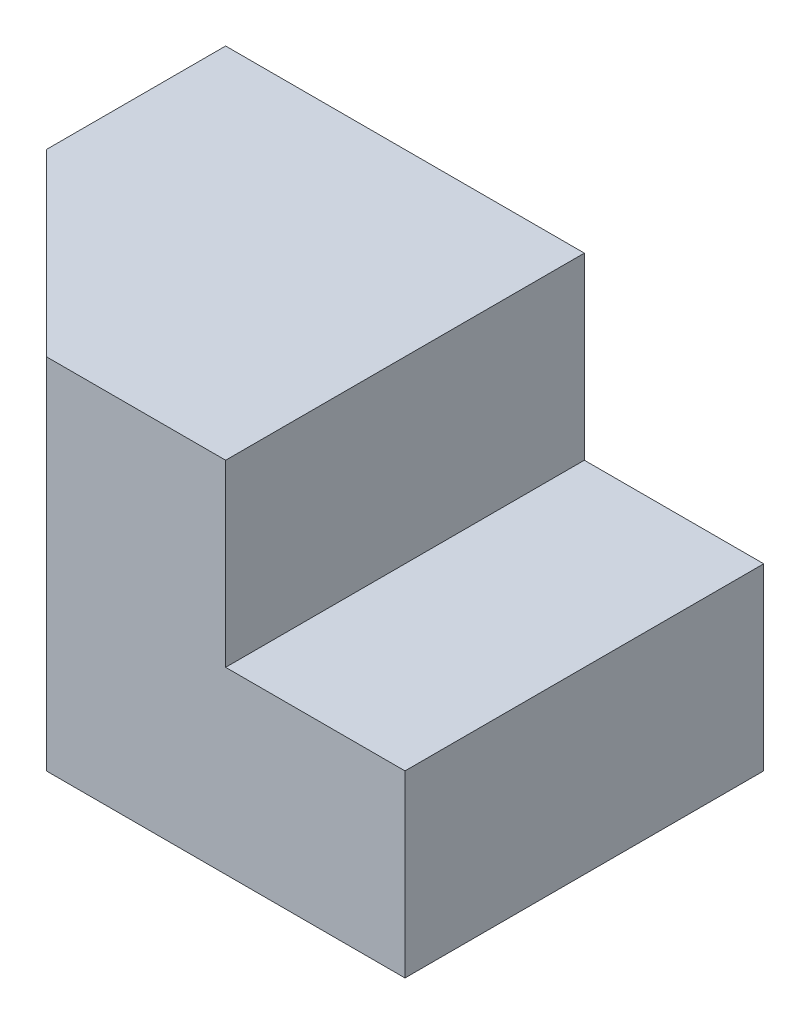
ISO-10303-21;
HEADER;
FILE_DESCRIPTION(('STEP AP214'),'2;1');
FILE_NAME('part.step','',(''),(''),'','','');
FILE_SCHEMA(('AUTOMOTIVE_DESIGN { 1 0 10303 214 1 1 1 1 }'));
ENDSEC;
DATA;
#1=APPLICATION_CONTEXT('core data for automotive mechanical design processes');
#2=APPLICATION_PROTOCOL_DEFINITION('international standard','automotive_design',2000,#1);
#3=PRODUCT_CONTEXT('',#1,'mechanical');
#4=PRODUCT('Part','Part','',(#3));
#5=PRODUCT_RELATED_PRODUCT_CATEGORY('part','',(#4));
#6=PRODUCT_DEFINITION_FORMATION('','',#4);
#7=PRODUCT_DEFINITION_CONTEXT('part definition',#1,'design');
#8=PRODUCT_DEFINITION('design','',#6,#7);
#9=PRODUCT_DEFINITION_SHAPE('','',#8);
#10=(LENGTH_UNIT() NAMED_UNIT(*) SI_UNIT(.MILLI.,.METRE.));
#11=(NAMED_UNIT(*) PLANE_ANGLE_UNIT() SI_UNIT($,.RADIAN.));
#12=(NAMED_UNIT(*) SI_UNIT($,.STERADIAN.) SOLID_ANGLE_UNIT());
#13=UNCERTAINTY_MEASURE_WITH_UNIT(LENGTH_MEASURE(1.E-05),#10,'distance_accuracy_value','');
#14=(GEOMETRIC_REPRESENTATION_CONTEXT(3) GLOBAL_UNCERTAINTY_ASSIGNED_CONTEXT((#13)) GLOBAL_UNIT_ASSIGNED_CONTEXT((#10,
#11,#12)) REPRESENTATION_CONTEXT('',''));
#15=CARTESIAN_POINT('',(0.,0.,0.));
#16=DIRECTION('',(0.,0.,1.));
#17=DIRECTION('',(1.,0.,0.));
#18=AXIS2_PLACEMENT_3D('',#15,#16,#17);
#19=CARTESIAN_POINT('',(-19.0958408679928,0.,40.));
#20=DIRECTION('',(1.,0.,0.));
#21=DIRECTION('',(0.,0.,-1.));
#22=AXIS2_PLACEMENT_3D('',#19,#20,#21);
#23=PLANE('',#22);
#24=DIRECTION('',(0.,-1.,0.));
#25=VECTOR('',#24,1.);
#26=CARTESIAN_POINT('',(-19.0958408679928,0.,0.));
#27=LINE('',#26,#25);
#28=CARTESIAN_POINT('',(-19.0958408679928,19.1320072332731,0.));
#29=VERTEX_POINT('',#28);
#30=CARTESIAN_POINT('',(-19.0958408679928,-0.867992766726944,0.));
#31=VERTEX_POINT('',#30);
#32=EDGE_CURVE('E116',#29,#31,#27,.T.);
#33=ORIENTED_EDGE('',*,*,#32,.F.);
#34=DIRECTION('',(0.,0.,-1.));
#35=VECTOR('',#34,1.);
#36=CARTESIAN_POINT('',(-19.0958408679928,19.1320072332731,40.));
#37=LINE('',#36,#35);
#38=CARTESIAN_POINT('',(-19.0958408679928,19.1320072332731,40.));
#39=VERTEX_POINT('',#38);
#40=EDGE_CURVE('E11',#39,#29,#37,.T.);
#41=ORIENTED_EDGE('',*,*,#40,.F.);
#42=DIRECTION('',(0.,-1.,0.));
#43=VECTOR('',#42,1.);
#44=CARTESIAN_POINT('',(-19.0958408679928,0.,40.));
#45=LINE('',#44,#43);
#46=CARTESIAN_POINT('',(-19.0958408679928,-0.867992766726944,40.));
#47=VERTEX_POINT('',#46);
#48=EDGE_CURVE('E148',#39,#47,#45,.T.);
#49=ORIENTED_EDGE('',*,*,#48,.T.);
#50=DIRECTION('',(0.,0.,-1.));
#51=VECTOR('',#50,1.);
#52=CARTESIAN_POINT('',(-19.0958408679928,-0.867992766726944,40.));
#53=LINE('',#52,#51);
#54=EDGE_CURVE('E92',#47,#31,#53,.T.);
#55=ORIENTED_EDGE('',*,*,#54,.T.);
#56=EDGE_LOOP('',(#33,#41,#49,#55));
#57=FACE_BOUND('',#56,.T.);
#58=ADVANCED_FACE('F41',(#57),#23,.T.);
#59=CARTESIAN_POINT('',(0.,19.1320072332731,40.));
#60=DIRECTION('',(0.,1.,0.));
#61=DIRECTION('',(-1.,0.,0.));
#62=AXIS2_PLACEMENT_3D('',#59,#60,#61);
#63=PLANE('',#62);
#64=DIRECTION('',(-0.707106781186548,0.,-0.707106781186547));
#65=VECTOR('',#64,1.);
#66=CARTESIAN_POINT('',(-39.0958408679928,19.1320072332731,40.));
#67=LINE('',#66,#65);
#68=CARTESIAN_POINT('',(-39.0958408679928,19.1320072332731,40.));
#69=VERTEX_POINT('',#68);
#70=CARTESIAN_POINT('',(-59.0958408679928,19.1320072332731,20.));
#71=VERTEX_POINT('',#70);
#72=EDGE_CURVE('E111',#69,#71,#67,.T.);
#73=ORIENTED_EDGE('',*,*,#72,.F.);
#74=DIRECTION('',(1.,0.,0.));
#75=VECTOR('',#74,1.);
#76=CARTESIAN_POINT('',(0.,19.1320072332731,40.));
#77=LINE('',#76,#75);
#78=EDGE_CURVE('E99',#69,#39,#77,.T.);
#79=ORIENTED_EDGE('',*,*,#78,.T.);
#80=ORIENTED_EDGE('',*,*,#40,.T.);
#81=DIRECTION('',(1.,0.,0.));
#82=VECTOR('',#81,1.);
#83=CARTESIAN_POINT('',(0.,19.1320072332731,0.));
#84=LINE('',#83,#82);
#85=CARTESIAN_POINT('',(-59.0958408679928,19.1320072332731,0.));
#86=VERTEX_POINT('',#85);
#87=EDGE_CURVE('E158',#86,#29,#84,.T.);
#88=ORIENTED_EDGE('',*,*,#87,.F.);
#89=DIRECTION('',(0.,0.,-1.));
#90=VECTOR('',#89,1.);
#91=CARTESIAN_POINT('',(-59.0958408679928,19.1320072332731,40.));
#92=LINE('',#91,#90);
#93=EDGE_CURVE('E49',#71,#86,#92,.T.);
#94=ORIENTED_EDGE('',*,*,#93,.F.);
#95=EDGE_LOOP('',(#73,#79,#80,#88,#94));
#96=FACE_BOUND('',#95,.T.);
#97=ADVANCED_FACE('F180',(#96),#63,.T.);
#98=CARTESIAN_POINT('',(-59.0958408679927,0.,40.));
#99=DIRECTION('',(1.,0.,0.));
#100=DIRECTION('',(0.,1.,0.));
#101=AXIS2_PLACEMENT_3D('',#98,#99,#100);
#102=PLANE('',#101);
#103=DIRECTION('',(0.,0.,-1.));
#104=VECTOR('',#103,1.);
#105=CARTESIAN_POINT('',(-59.0958408679927,-20.8679927667269,40.));
#106=LINE('',#105,#104);
#107=CARTESIAN_POINT('',(-59.0958408679927,-20.8679927667269,20.));
#108=VERTEX_POINT('',#107);
#109=CARTESIAN_POINT('',(-59.0958408679927,-20.8679927667269,0.));
#110=VERTEX_POINT('',#109);
#111=EDGE_CURVE('E123',#108,#110,#106,.T.);
#112=ORIENTED_EDGE('',*,*,#111,.F.);
#113=DIRECTION('',(0.,1.,0.));
#114=VECTOR('',#113,1.);
#115=CARTESIAN_POINT('',(-59.0958408679927,-20.8679927667269,20.));
#116=LINE('',#115,#114);
#117=EDGE_CURVE('E109',#108,#71,#116,.T.);
#118=ORIENTED_EDGE('',*,*,#117,.T.);
#119=ORIENTED_EDGE('',*,*,#93,.T.);
#120=DIRECTION('',(0.,-1.,0.));
#121=VECTOR('',#120,1.);
#122=CARTESIAN_POINT('',(-59.0958408679927,0.,0.));
#123=LINE('',#122,#121);
#124=EDGE_CURVE('E131',#86,#110,#123,.T.);
#125=ORIENTED_EDGE('',*,*,#124,.T.);
#126=EDGE_LOOP('',(#112,#118,#119,#125));
#127=FACE_BOUND('',#126,.T.);
#128=ADVANCED_FACE('F129',(#127),#102,.F.);
#129=CARTESIAN_POINT('',(0.,-20.8679927667269,40.));
#130=DIRECTION('',(0.,1.,0.));
#131=DIRECTION('',(0.,0.,1.));
#132=AXIS2_PLACEMENT_3D('',#129,#130,#131);
#133=PLANE('',#132);
#134=DIRECTION('',(1.,0.,0.));
#135=VECTOR('',#134,1.);
#136=CARTESIAN_POINT('',(0.,-20.8679927667269,40.));
#137=LINE('',#136,#135);
#138=CARTESIAN_POINT('',(-39.0958408679927,-20.8679927667269,40.));
#139=VERTEX_POINT('',#138);
#140=CARTESIAN_POINT('',(0.904159132007247,-20.8679927667269,40.));
#141=VERTEX_POINT('',#140);
#142=EDGE_CURVE('E126',#139,#141,#137,.T.);
#143=ORIENTED_EDGE('',*,*,#142,.F.);
#144=DIRECTION('',(-0.707106781186548,0.,-0.707106781186547));
#145=VECTOR('',#144,1.);
#146=CARTESIAN_POINT('',(-39.0958408679927,-20.8679927667269,40.));
#147=LINE('',#146,#145);
#148=EDGE_CURVE('E56',#139,#108,#147,.T.);
#149=ORIENTED_EDGE('',*,*,#148,.T.);
#150=ORIENTED_EDGE('',*,*,#111,.T.);
#151=DIRECTION('',(1.,0.,0.));
#152=VECTOR('',#151,1.);
#153=CARTESIAN_POINT('',(0.,-20.8679927667269,0.));
#154=LINE('',#153,#152);
#155=CARTESIAN_POINT('',(0.904159132007247,-20.8679927667269,0.));
#156=VERTEX_POINT('',#155);
#157=EDGE_CURVE('E153',#110,#156,#154,.T.);
#158=ORIENTED_EDGE('',*,*,#157,.T.);
#159=DIRECTION('',(0.,0.,-1.));
#160=VECTOR('',#159,1.);
#161=CARTESIAN_POINT('',(0.904159132007247,-20.8679927667269,40.));
#162=LINE('',#161,#160);
#163=EDGE_CURVE('E134',#141,#156,#162,.T.);
#164=ORIENTED_EDGE('',*,*,#163,.F.);
#165=EDGE_LOOP('',(#143,#149,#150,#158,#164));
#166=FACE_BOUND('',#165,.T.);
#167=ADVANCED_FACE('F121',(#166),#133,.F.);
#168=CARTESIAN_POINT('',(0.904159132007242,0.,40.));
#169=DIRECTION('',(1.,0.,0.));
#170=DIRECTION('',(0.,1.,0.));
#171=AXIS2_PLACEMENT_3D('',#168,#169,#170);
#172=PLANE('',#171);
#173=DIRECTION('',(0.,-1.,0.));
#174=VECTOR('',#173,1.);
#175=CARTESIAN_POINT('',(0.904159132007242,0.,0.));
#176=LINE('',#175,#174);
#177=CARTESIAN_POINT('',(0.904159132007242,-0.867992766726941,0.));
#178=VERTEX_POINT('',#177);
#179=EDGE_CURVE('E149',#178,#156,#176,.T.);
#180=ORIENTED_EDGE('',*,*,#179,.F.);
#181=DIRECTION('',(0.,0.,-1.));
#182=VECTOR('',#181,1.);
#183=CARTESIAN_POINT('',(0.904159132007242,-0.867992766726941,40.));
#184=LINE('',#183,#182);
#185=CARTESIAN_POINT('',(0.904159132007242,-0.867992766726941,40.));
#186=VERTEX_POINT('',#185);
#187=EDGE_CURVE('E138',#186,#178,#184,.T.);
#188=ORIENTED_EDGE('',*,*,#187,.F.);
#189=DIRECTION('',(0.,-1.,0.));
#190=VECTOR('',#189,1.);
#191=CARTESIAN_POINT('',(0.904159132007242,0.,40.));
#192=LINE('',#191,#190);
#193=EDGE_CURVE('E167',#186,#141,#192,.T.);
#194=ORIENTED_EDGE('',*,*,#193,.T.);
#195=ORIENTED_EDGE('',*,*,#163,.T.);
#196=EDGE_LOOP('',(#180,#188,#194,#195));
#197=FACE_BOUND('',#196,.T.);
#198=ADVANCED_FACE('F188',(#197),#172,.T.);
#199=CARTESIAN_POINT('',(0.,-0.867992766726941,40.));
#200=DIRECTION('',(0.,-1.,0.));
#201=DIRECTION('',(1.,0.,0.));
#202=AXIS2_PLACEMENT_3D('',#199,#200,#201);
#203=PLANE('',#202);
#204=DIRECTION('',(-1.,0.,0.));
#205=VECTOR('',#204,1.);
#206=CARTESIAN_POINT('',(0.,-0.867992766726941,0.));
#207=LINE('',#206,#205);
#208=EDGE_CURVE('E145',#178,#31,#207,.T.);
#209=ORIENTED_EDGE('',*,*,#208,.T.);
#210=ORIENTED_EDGE('',*,*,#54,.F.);
#211=DIRECTION('',(-1.,0.,0.));
#212=VECTOR('',#211,1.);
#213=CARTESIAN_POINT('',(0.,-0.867992766726941,40.));
#214=LINE('',#213,#212);
#215=EDGE_CURVE('E65',#186,#47,#214,.T.);
#216=ORIENTED_EDGE('',*,*,#215,.F.);
#217=ORIENTED_EDGE('',*,*,#187,.T.);
#218=EDGE_LOOP('',(#209,#210,#216,#217));
#219=FACE_BOUND('',#218,.T.);
#220=ADVANCED_FACE('F190',(#219),#203,.F.);
#221=CARTESIAN_POINT('',(0.,0.,40.));
#222=DIRECTION('',(0.,0.,1.));
#223=DIRECTION('',(1.,0.,0.));
#224=AXIS2_PLACEMENT_3D('',#221,#222,#223);
#225=PLANE('',#224);
#226=DIRECTION('',(0.,1.,0.));
#227=VECTOR('',#226,1.);
#228=CARTESIAN_POINT('',(-39.0958408679927,-20.8679927667269,40.));
#229=LINE('',#228,#227);
#230=EDGE_CURVE('E117',#139,#69,#229,.T.);
#231=ORIENTED_EDGE('',*,*,#230,.F.);
#232=ORIENTED_EDGE('',*,*,#142,.T.);
#233=ORIENTED_EDGE('',*,*,#193,.F.);
#234=ORIENTED_EDGE('',*,*,#215,.T.);
#235=ORIENTED_EDGE('',*,*,#48,.F.);
#236=ORIENTED_EDGE('',*,*,#78,.F.);
#237=EDGE_LOOP('',(#231,#232,#233,#234,#235,#236));
#238=FACE_BOUND('',#237,.T.);
#239=ADVANCED_FACE('F182',(#238),#225,.T.);
#240=CARTESIAN_POINT('',(0.,0.,0.));
#241=DIRECTION('',(0.,0.,1.));
#242=DIRECTION('',(1.,0.,0.));
#243=AXIS2_PLACEMENT_3D('',#240,#241,#242);
#244=PLANE('',#243);
#245=ORIENTED_EDGE('',*,*,#32,.T.);
#246=ORIENTED_EDGE('',*,*,#208,.F.);
#247=ORIENTED_EDGE('',*,*,#179,.T.);
#248=ORIENTED_EDGE('',*,*,#157,.F.);
#249=ORIENTED_EDGE('',*,*,#124,.F.);
#250=ORIENTED_EDGE('',*,*,#87,.T.);
#251=EDGE_LOOP('',(#245,#246,#247,#248,#249,#250));
#252=FACE_BOUND('',#251,.T.);
#253=ADVANCED_FACE('F184',(#252),#244,.F.);
#254=CARTESIAN_POINT('',(-39.0958408679927,-20.8679927667269,40.));
#255=DIRECTION('',(0.707106781186547,0.,-0.707106781186548));
#256=DIRECTION('',(-0.707106781186548,0.,-0.707106781186547));
#257=AXIS2_PLACEMENT_3D('',#254,#255,#256);
#258=PLANE('',#257);
#259=ORIENTED_EDGE('',*,*,#72,.T.);
#260=ORIENTED_EDGE('',*,*,#117,.F.);
#261=ORIENTED_EDGE('',*,*,#148,.F.);
#262=ORIENTED_EDGE('',*,*,#230,.T.);
#263=EDGE_LOOP('',(#259,#260,#261,#262));
#264=FACE_BOUND('',#263,.T.);
#265=ADVANCED_FACE('F110',(#264),#258,.F.);
#266=CLOSED_SHELL('',(#58,#97,#128,#167,#198,#220,#239,#253,#265));
#267=MANIFOLD_SOLID_BREP('B2',#266);
#268=ADVANCED_BREP_SHAPE_REPRESENTATION('',(#18,#267),#14);
#269=SHAPE_DEFINITION_REPRESENTATION(#9,#268);
ENDSEC;
END-ISO-10303-21;
